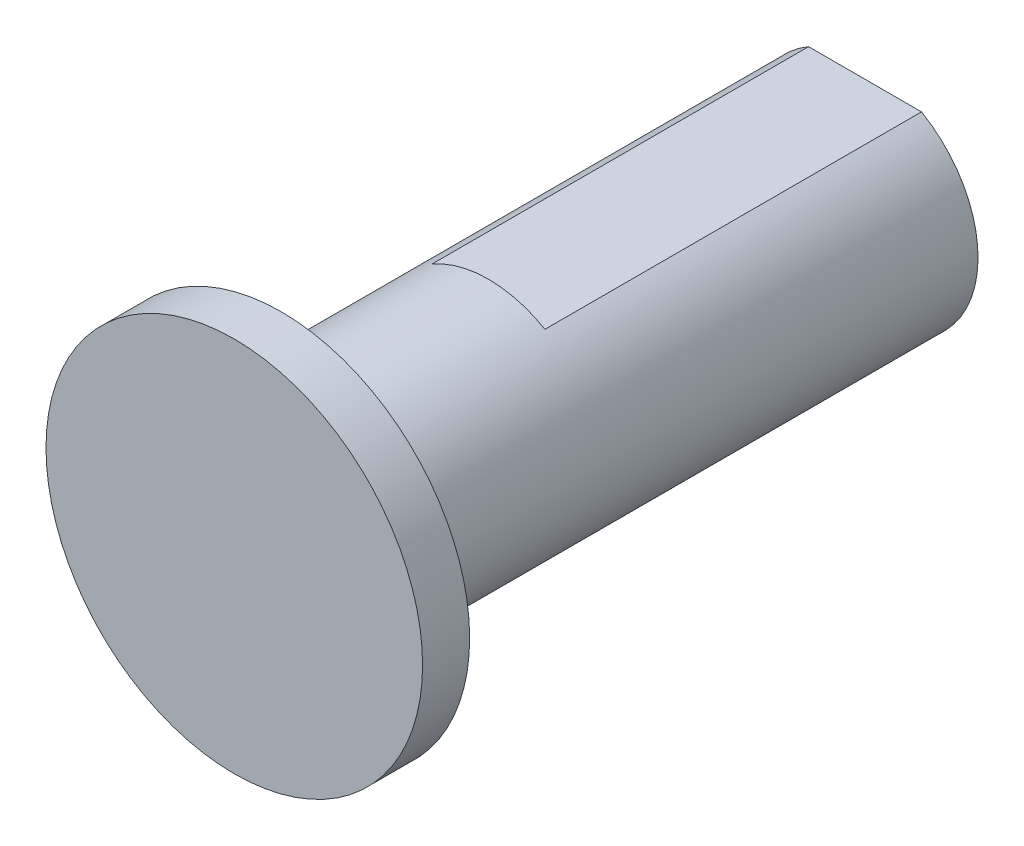
ISO-10303-21;
HEADER;
FILE_DESCRIPTION(('STEP AP214'),'2;1');
FILE_NAME('part.step','',(''),(''),'','','');
FILE_SCHEMA(('AUTOMOTIVE_DESIGN { 1 0 10303 214 1 1 1 1 }'));
ENDSEC;
DATA;
#1=APPLICATION_CONTEXT('core data for automotive mechanical design processes');
#2=APPLICATION_PROTOCOL_DEFINITION('international standard','automotive_design',2000,#1);
#3=PRODUCT_CONTEXT('',#1,'mechanical');
#4=PRODUCT('Part','Part','',(#3));
#5=PRODUCT_RELATED_PRODUCT_CATEGORY('part','',(#4));
#6=PRODUCT_DEFINITION_FORMATION('','',#4);
#7=PRODUCT_DEFINITION_CONTEXT('part definition',#1,'design');
#8=PRODUCT_DEFINITION('design','',#6,#7);
#9=PRODUCT_DEFINITION_SHAPE('','',#8);
#10=(LENGTH_UNIT() NAMED_UNIT(*) SI_UNIT(.MILLI.,.METRE.));
#11=(NAMED_UNIT(*) PLANE_ANGLE_UNIT() SI_UNIT($,.RADIAN.));
#12=(NAMED_UNIT(*) SI_UNIT($,.STERADIAN.) SOLID_ANGLE_UNIT());
#13=UNCERTAINTY_MEASURE_WITH_UNIT(LENGTH_MEASURE(1.E-05),#10,'distance_accuracy_value','');
#14=(GEOMETRIC_REPRESENTATION_CONTEXT(3) GLOBAL_UNCERTAINTY_ASSIGNED_CONTEXT((#13)) GLOBAL_UNIT_ASSIGNED_CONTEXT((#10,
#11,#12)) REPRESENTATION_CONTEXT('',''));
#15=CARTESIAN_POINT('',(0.,0.,0.));
#16=DIRECTION('',(0.,0.,1.));
#17=DIRECTION('',(1.,0.,0.));
#18=AXIS2_PLACEMENT_3D('',#15,#16,#17);
#19=CARTESIAN_POINT('',(0.,0.,31.));
#20=DIRECTION('',(0.,0.,-1.));
#21=DIRECTION('',(-1.,0.,0.));
#22=AXIS2_PLACEMENT_3D('',#19,#20,#21);
#23=CYLINDRICAL_SURFACE('',#22,6.);
#24=CARTESIAN_POINT('',(0.,0.,31.));
#25=DIRECTION('',(0.,0.,1.));
#26=DIRECTION('',(1.,0.,0.));
#27=AXIS2_PLACEMENT_3D('',#24,#25,#26);
#28=CIRCLE('',#27,6.);
#29=CARTESIAN_POINT('',(6.,0.,31.));
#30=VERTEX_POINT('',#29);
#31=EDGE_CURVE('E11',#30,#30,#28,.T.);
#32=ORIENTED_EDGE('',*,*,#31,.F.);
#33=EDGE_LOOP('',(#32));
#34=FACE_BOUND('',#33,.T.);
#35=CARTESIAN_POINT('',(0.,0.,20.));
#36=DIRECTION('',(0.,0.,-1.));
#37=DIRECTION('',(-1.,0.,0.));
#38=AXIS2_PLACEMENT_3D('',#35,#36,#37);
#39=CIRCLE('',#38,6.);
#40=CARTESIAN_POINT('',(-3.,5.19615242270663,20.));
#41=VERTEX_POINT('',#40);
#42=CARTESIAN_POINT('',(3.,5.19615242270663,20.));
#43=VERTEX_POINT('',#42);
#44=EDGE_CURVE('E77',#41,#43,#39,.T.);
#45=ORIENTED_EDGE('',*,*,#44,.F.);
#46=DIRECTION('',(0.,0.,-1.));
#47=VECTOR('',#46,1.);
#48=CARTESIAN_POINT('',(-3.,5.19615242270663,20.));
#49=LINE('',#48,#47);
#50=CARTESIAN_POINT('',(-3.,5.19615242270663,0.));
#51=VERTEX_POINT('',#50);
#52=EDGE_CURVE('E66',#41,#51,#49,.T.);
#53=ORIENTED_EDGE('',*,*,#52,.T.);
#54=CARTESIAN_POINT('',(0.,0.,0.));
#55=DIRECTION('',(0.,0.,1.));
#56=DIRECTION('',(1.,0.,0.));
#57=AXIS2_PLACEMENT_3D('',#54,#55,#56);
#58=CIRCLE('',#57,6.);
#59=CARTESIAN_POINT('',(3.,5.19615242270663,0.));
#60=VERTEX_POINT('',#59);
#61=EDGE_CURVE('E48',#51,#60,#58,.T.);
#62=ORIENTED_EDGE('',*,*,#61,.T.);
#63=DIRECTION('',(0.,0.,-1.));
#64=VECTOR('',#63,1.);
#65=CARTESIAN_POINT('',(3.,5.19615242270663,20.));
#66=LINE('',#65,#64);
#67=EDGE_CURVE('E60',#43,#60,#66,.T.);
#68=ORIENTED_EDGE('',*,*,#67,.F.);
#69=EDGE_LOOP('',(#45,#53,#62,#68));
#70=FACE_BOUND('',#69,.T.);
#71=ADVANCED_FACE('F45',(#34,#70),#23,.T.);
#72=CARTESIAN_POINT('',(0.,0.,0.));
#73=DIRECTION('',(0.,0.,1.));
#74=DIRECTION('',(1.,0.,0.));
#75=AXIS2_PLACEMENT_3D('',#72,#73,#74);
#76=PLANE('',#75);
#77=ORIENTED_EDGE('',*,*,#61,.F.);
#78=DIRECTION('',(-1.,0.,0.));
#79=VECTOR('',#78,1.);
#80=CARTESIAN_POINT('',(0.,5.19615242270663,0.));
#81=LINE('',#80,#79);
#82=EDGE_CURVE('E71',#60,#51,#81,.T.);
#83=ORIENTED_EDGE('',*,*,#82,.F.);
#84=EDGE_LOOP('',(#77,#83));
#85=FACE_BOUND('',#84,.T.);
#86=ADVANCED_FACE('F84',(#85),#76,.F.);
#87=CARTESIAN_POINT('',(0.,5.19615242270663,20.));
#88=DIRECTION('',(0.,-1.,0.));
#89=DIRECTION('',(0.,0.,-1.));
#90=AXIS2_PLACEMENT_3D('',#87,#88,#89);
#91=PLANE('',#90);
#92=ORIENTED_EDGE('',*,*,#82,.T.);
#93=ORIENTED_EDGE('',*,*,#52,.F.);
#94=DIRECTION('',(-1.,0.,0.));
#95=VECTOR('',#94,1.);
#96=CARTESIAN_POINT('',(0.,5.19615242270663,20.));
#97=LINE('',#96,#95);
#98=EDGE_CURVE('E88',#43,#41,#97,.T.);
#99=ORIENTED_EDGE('',*,*,#98,.F.);
#100=ORIENTED_EDGE('',*,*,#67,.T.);
#101=EDGE_LOOP('',(#92,#93,#99,#100));
#102=FACE_BOUND('',#101,.T.);
#103=ADVANCED_FACE('F72',(#102),#91,.F.);
#104=CARTESIAN_POINT('',(0.,0.,20.));
#105=DIRECTION('',(0.,0.,-1.));
#106=DIRECTION('',(-1.,0.,0.));
#107=AXIS2_PLACEMENT_3D('',#104,#105,#106);
#108=PLANE('',#107);
#109=ORIENTED_EDGE('',*,*,#44,.T.);
#110=ORIENTED_EDGE('',*,*,#98,.T.);
#111=EDGE_LOOP('',(#109,#110));
#112=FACE_BOUND('',#111,.T.);
#113=ADVANCED_FACE('F124',(#112),#108,.T.);
#114=CARTESIAN_POINT('',(0.,0.,33.5));
#115=DIRECTION('',(0.,0.,-1.));
#116=DIRECTION('',(-1.,0.,0.));
#117=AXIS2_PLACEMENT_3D('',#114,#115,#116);
#118=CYLINDRICAL_SURFACE('',#117,10.);
#119=CARTESIAN_POINT('',(0.,0.,33.5));
#120=DIRECTION('',(0.,0.,1.));
#121=DIRECTION('',(1.,0.,0.));
#122=AXIS2_PLACEMENT_3D('',#119,#120,#121);
#123=CIRCLE('',#122,10.);
#124=CARTESIAN_POINT('',(10.,0.,33.5));
#125=VERTEX_POINT('',#124);
#126=EDGE_CURVE('E78',#125,#125,#123,.T.);
#127=ORIENTED_EDGE('',*,*,#126,.F.);
#128=EDGE_LOOP('',(#127));
#129=FACE_BOUND('',#128,.T.);
#130=CARTESIAN_POINT('',(0.,0.,31.));
#131=DIRECTION('',(0.,0.,1.));
#132=DIRECTION('',(1.,0.,0.));
#133=AXIS2_PLACEMENT_3D('',#130,#131,#132);
#134=CIRCLE('',#133,10.);
#135=CARTESIAN_POINT('',(10.,0.,31.));
#136=VERTEX_POINT('',#135);
#137=EDGE_CURVE('E96',#136,#136,#134,.T.);
#138=ORIENTED_EDGE('',*,*,#137,.T.);
#139=EDGE_LOOP('',(#138));
#140=FACE_BOUND('',#139,.T.);
#141=ADVANCED_FACE('F102',(#129,#140),#118,.T.);
#142=CARTESIAN_POINT('',(0.,0.,33.5));
#143=DIRECTION('',(0.,0.,1.));
#144=DIRECTION('',(1.,0.,0.));
#145=AXIS2_PLACEMENT_3D('',#142,#143,#144);
#146=PLANE('',#145);
#147=ORIENTED_EDGE('',*,*,#126,.T.);
#148=EDGE_LOOP('',(#147));
#149=FACE_BOUND('',#148,.T.);
#150=ADVANCED_FACE('F106',(#149),#146,.T.);
#151=CARTESIAN_POINT('',(0.,0.,31.));
#152=DIRECTION('',(0.,0.,1.));
#153=DIRECTION('',(1.,0.,0.));
#154=AXIS2_PLACEMENT_3D('',#151,#152,#153);
#155=PLANE('',#154);
#156=ORIENTED_EDGE('',*,*,#31,.T.);
#157=EDGE_LOOP('',(#156));
#158=FACE_BOUND('',#157,.T.);
#159=ORIENTED_EDGE('',*,*,#137,.F.);
#160=EDGE_LOOP('',(#159));
#161=FACE_BOUND('',#160,.T.);
#162=ADVANCED_FACE('F104',(#158,#161),#155,.F.);
#163=CLOSED_SHELL('',(#71,#86,#103,#113,#141,#150,#162));
#164=MANIFOLD_SOLID_BREP('B2',#163);
#165=ADVANCED_BREP_SHAPE_REPRESENTATION('',(#18,#164),#14);
#166=SHAPE_DEFINITION_REPRESENTATION(#9,#165);
ENDSEC;
END-ISO-10303-21;
